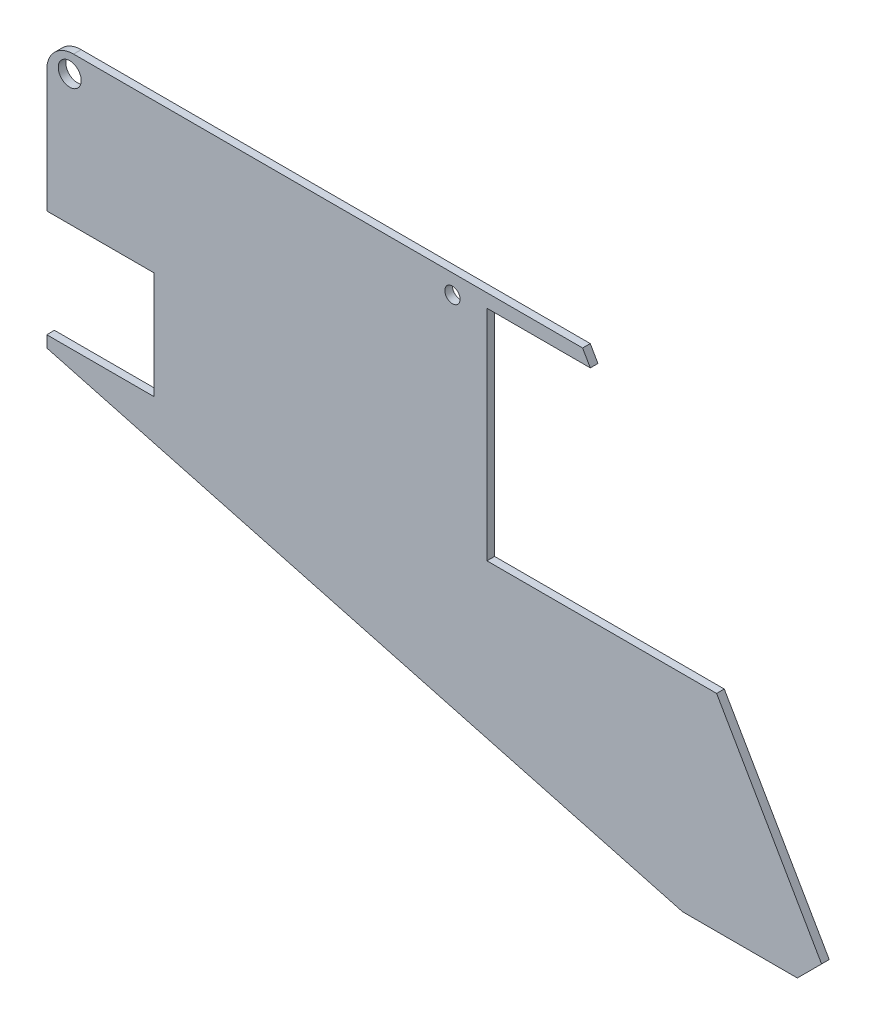
ISO-10303-21;
HEADER;
FILE_DESCRIPTION(('STEP AP214'),'2;1');
FILE_NAME('part.step','',(''),(''),'','','');
FILE_SCHEMA(('AUTOMOTIVE_DESIGN { 1 0 10303 214 1 1 1 1 }'));
ENDSEC;
DATA;
#1=APPLICATION_CONTEXT('core data for automotive mechanical design processes');
#2=APPLICATION_PROTOCOL_DEFINITION('international standard','automotive_design',2000,#1);
#3=PRODUCT_CONTEXT('',#1,'mechanical');
#4=PRODUCT('Part','Part','',(#3));
#5=PRODUCT_RELATED_PRODUCT_CATEGORY('part','',(#4));
#6=PRODUCT_DEFINITION_FORMATION('','',#4);
#7=PRODUCT_DEFINITION_CONTEXT('part definition',#1,'design');
#8=PRODUCT_DEFINITION('design','',#6,#7);
#9=PRODUCT_DEFINITION_SHAPE('','',#8);
#10=(LENGTH_UNIT() NAMED_UNIT(*) SI_UNIT(.MILLI.,.METRE.));
#11=(NAMED_UNIT(*) PLANE_ANGLE_UNIT() SI_UNIT($,.RADIAN.));
#12=(NAMED_UNIT(*) SI_UNIT($,.STERADIAN.) SOLID_ANGLE_UNIT());
#13=UNCERTAINTY_MEASURE_WITH_UNIT(LENGTH_MEASURE(1.E-05),#10,'distance_accuracy_value','');
#14=(GEOMETRIC_REPRESENTATION_CONTEXT(3) GLOBAL_UNCERTAINTY_ASSIGNED_CONTEXT((#13)) GLOBAL_UNIT_ASSIGNED_CONTEXT((#10,
#11,#12)) REPRESENTATION_CONTEXT('',''));
#15=CARTESIAN_POINT('',(0.,0.,0.));
#16=DIRECTION('',(0.,0.,1.));
#17=DIRECTION('',(1.,0.,0.));
#18=AXIS2_PLACEMENT_3D('',#15,#16,#17);
#19=CARTESIAN_POINT('',(-350.,0.,5.));
#20=DIRECTION('',(1.,0.,0.));
#21=DIRECTION('',(0.,0.,-1.));
#22=AXIS2_PLACEMENT_3D('',#19,#20,#21);
#23=PLANE('',#22);
#24=DIRECTION('',(0.,-1.,0.));
#25=VECTOR('',#24,1.);
#26=CARTESIAN_POINT('',(-350.,0.,-5.));
#27=LINE('',#26,#25);
#28=CARTESIAN_POINT('',(-350.,140.,-5.));
#29=VERTEX_POINT('',#28);
#30=CARTESIAN_POINT('',(-350.,-20.,-5.));
#31=VERTEX_POINT('',#30);
#32=EDGE_CURVE('E175',#29,#31,#27,.T.);
#33=ORIENTED_EDGE('',*,*,#32,.T.);
#34=DIRECTION('',(0.,0.,1.));
#35=VECTOR('',#34,1.);
#36=CARTESIAN_POINT('',(-350.,-20.,-5.));
#37=LINE('',#36,#35);
#38=CARTESIAN_POINT('',(-350.,-20.,5.));
#39=VERTEX_POINT('',#38);
#40=EDGE_CURVE('E248',#31,#39,#37,.T.);
#41=ORIENTED_EDGE('',*,*,#40,.T.);
#42=DIRECTION('',(0.,-1.,0.));
#43=VECTOR('',#42,1.);
#44=CARTESIAN_POINT('',(-350.,0.,5.));
#45=LINE('',#44,#43);
#46=CARTESIAN_POINT('',(-350.,140.,5.));
#47=VERTEX_POINT('',#46);
#48=EDGE_CURVE('E249',#47,#39,#45,.T.);
#49=ORIENTED_EDGE('',*,*,#48,.F.);
#50=DIRECTION('',(0.,0.,-1.));
#51=VECTOR('',#50,1.);
#52=CARTESIAN_POINT('',(-350.,140.,5.));
#53=LINE('',#52,#51);
#54=EDGE_CURVE('E203',#47,#29,#53,.T.);
#55=ORIENTED_EDGE('',*,*,#54,.T.);
#56=EDGE_LOOP('',(#33,#41,#49,#55));
#57=FACE_BOUND('',#56,.T.);
#58=ADVANCED_FACE('F43',(#57),#23,.F.);
#59=CARTESIAN_POINT('',(338.27722283114,195.304445662275,5.));
#60=DIRECTION('',(-0.866025403784442,-0.499999999999995,0.));
#61=DIRECTION('',(0.499999999999995,-0.866025403784442,0.));
#62=AXIS2_PLACEMENT_3D('',#59,#60,#61);
#63=PLANE('',#62);
#64=DIRECTION('',(-0.499999999999995,0.866025403784442,0.));
#65=VECTOR('',#64,1.);
#66=CARTESIAN_POINT('',(338.27722283114,195.304445662275,5.));
#67=LINE('',#66,#65);
#68=CARTESIAN_POINT('',(662.259526419155,-365.84936490538,5.));
#69=VERTEX_POINT('',#68);
#70=CARTESIAN_POINT('',(525.111069989298,-128.301270189222,5.));
#71=VERTEX_POINT('',#70);
#72=EDGE_CURVE('E221',#69,#71,#67,.T.);
#73=ORIENTED_EDGE('',*,*,#72,.F.);
#74=DIRECTION('',(0.,0.,-1.));
#75=VECTOR('',#74,1.);
#76=CARTESIAN_POINT('',(662.259526419155,-365.84936490538,5.));
#77=LINE('',#76,#75);
#78=CARTESIAN_POINT('',(662.259526419155,-365.84936490538,-5.));
#79=VERTEX_POINT('',#78);
#80=EDGE_CURVE('E212',#69,#79,#77,.T.);
#81=ORIENTED_EDGE('',*,*,#80,.T.);
#82=DIRECTION('',(-0.499999999999995,0.866025403784442,0.));
#83=VECTOR('',#82,1.);
#84=CARTESIAN_POINT('',(338.27722283114,195.304445662275,-5.));
#85=LINE('',#84,#83);
#86=CARTESIAN_POINT('',(525.111069989298,-128.301270189222,-5.));
#87=VERTEX_POINT('',#86);
#88=EDGE_CURVE('E190',#79,#87,#85,.T.);
#89=ORIENTED_EDGE('',*,*,#88,.T.);
#90=DIRECTION('',(0.,0.,1.));
#91=VECTOR('',#90,1.);
#92=CARTESIAN_POINT('',(525.111069989298,-128.301270189222,-5.));
#93=LINE('',#92,#91);
#94=EDGE_CURVE('E295',#87,#71,#93,.T.);
#95=ORIENTED_EDGE('',*,*,#94,.T.);
#96=EDGE_LOOP('',(#73,#81,#89,#95));
#97=FACE_BOUND('',#96,.T.);
#98=ADVANCED_FACE('F218',(#97),#63,.F.);
#99=CARTESIAN_POINT('',(-350.,-160.,5.));
#100=VERTEX_POINT('',#99);
#101=CARTESIAN_POINT('',(-350.,-175.,5.));
#102=VERTEX_POINT('',#101);
#103=EDGE_CURVE('E169',#100,#102,#45,.T.);
#104=ORIENTED_EDGE('',*,*,#103,.F.);
#105=DIRECTION('',(0.,0.,1.));
#106=VECTOR('',#105,1.);
#107=CARTESIAN_POINT('',(-350.,-160.,-5.));
#108=LINE('',#107,#106);
#109=CARTESIAN_POINT('',(-350.,-160.,-5.));
#110=VERTEX_POINT('',#109);
#111=EDGE_CURVE('E155',#110,#100,#108,.T.);
#112=ORIENTED_EDGE('',*,*,#111,.F.);
#113=CARTESIAN_POINT('',(-350.,-175.,-5.));
#114=VERTEX_POINT('',#113);
#115=EDGE_CURVE('E167',#110,#114,#27,.T.);
#116=ORIENTED_EDGE('',*,*,#115,.T.);
#117=DIRECTION('',(0.,0.,-1.));
#118=VECTOR('',#117,1.);
#119=CARTESIAN_POINT('',(-350.,-175.,5.));
#120=LINE('',#119,#118);
#121=EDGE_CURVE('E201',#102,#114,#120,.T.);
#122=ORIENTED_EDGE('',*,*,#121,.F.);
#123=EDGE_LOOP('',(#104,#112,#116,#122));
#124=FACE_BOUND('',#123,.T.);
#125=ADVANCED_FACE('F165',(#124),#23,.F.);
#126=CARTESIAN_POINT('',(-67.195554337721,-250.777222831137,5.));
#127=DIRECTION('',(0.258819045102514,0.96592582628907,0.));
#128=DIRECTION('',(-0.96592582628907,0.258819045102514,0.));
#129=AXIS2_PLACEMENT_3D('',#126,#127,#128);
#130=PLANE('',#129);
#131=DIRECTION('',(0.96592582628907,-0.258819045102514,0.));
#132=VECTOR('',#131,1.);
#133=CARTESIAN_POINT('',(-67.195554337721,-250.777222831137,-5.));
#134=LINE('',#133,#132);
#135=CARTESIAN_POINT('',(480.560796608377,-397.548094716159,-5.));
#136=VERTEX_POINT('',#135);
#137=EDGE_CURVE('E173',#114,#136,#134,.T.);
#138=ORIENTED_EDGE('',*,*,#137,.T.);
#139=DIRECTION('',(0.,0.,-1.));
#140=VECTOR('',#139,1.);
#141=CARTESIAN_POINT('',(480.560796608377,-397.548094716159,5.));
#142=LINE('',#141,#140);
#143=CARTESIAN_POINT('',(480.560796608377,-397.548094716159,5.));
#144=VERTEX_POINT('',#143);
#145=EDGE_CURVE('E198',#144,#136,#142,.T.);
#146=ORIENTED_EDGE('',*,*,#145,.F.);
#147=DIRECTION('',(0.96592582628907,-0.258819045102514,0.));
#148=VECTOR('',#147,1.);
#149=CARTESIAN_POINT('',(-67.195554337721,-250.777222831137,5.));
#150=LINE('',#149,#148);
#151=EDGE_CURVE('E252',#102,#144,#150,.T.);
#152=ORIENTED_EDGE('',*,*,#151,.F.);
#153=ORIENTED_EDGE('',*,*,#121,.T.);
#154=EDGE_LOOP('',(#138,#146,#152,#153));
#155=FACE_BOUND('',#154,.T.);
#156=ADVANCED_FACE('F335',(#155),#130,.F.);
#157=CARTESIAN_POINT('',(0.,-397.548094716159,5.));
#158=DIRECTION('',(0.,1.,0.));
#159=DIRECTION('',(0.,0.,1.));
#160=AXIS2_PLACEMENT_3D('',#157,#158,#159);
#161=PLANE('',#160);
#162=DIRECTION('',(1.,0.,0.));
#163=VECTOR('',#162,1.);
#164=CARTESIAN_POINT('',(0.,-397.548094716159,-5.));
#165=LINE('',#164,#163);
#166=CARTESIAN_POINT('',(630.560796608377,-397.548094716159,-5.));
#167=VERTEX_POINT('',#166);
#168=EDGE_CURVE('E187',#136,#167,#165,.T.);
#169=ORIENTED_EDGE('',*,*,#168,.T.);
#170=DIRECTION('',(0.,0.,1.));
#171=VECTOR('',#170,1.);
#172=CARTESIAN_POINT('',(630.560796608377,-397.548094716159,5.));
#173=LINE('',#172,#171);
#174=CARTESIAN_POINT('',(630.560796608377,-397.548094716159,5.));
#175=VERTEX_POINT('',#174);
#176=EDGE_CURVE('E52',#167,#175,#173,.T.);
#177=ORIENTED_EDGE('',*,*,#176,.T.);
#178=DIRECTION('',(1.,0.,0.));
#179=VECTOR('',#178,1.);
#180=CARTESIAN_POINT('',(0.,-397.548094716159,5.));
#181=LINE('',#180,#179);
#182=EDGE_CURVE('E254',#144,#175,#181,.T.);
#183=ORIENTED_EDGE('',*,*,#182,.F.);
#184=ORIENTED_EDGE('',*,*,#145,.T.);
#185=EDGE_LOOP('',(#169,#177,#183,#184));
#186=FACE_BOUND('',#185,.T.);
#187=ADVANCED_FACE('F339',(#186),#161,.F.);
#188=CARTESIAN_POINT('',(360.111069989298,157.487113059643,5.));
#189=VERTEX_POINT('',#188);
#190=CARTESIAN_POINT('',(350.,175.,5.));
#191=VERTEX_POINT('',#190);
#192=EDGE_CURVE('E255',#189,#191,#67,.T.);
#193=ORIENTED_EDGE('',*,*,#192,.F.);
#194=DIRECTION('',(0.,0.,1.));
#195=VECTOR('',#194,1.);
#196=CARTESIAN_POINT('',(360.111069989298,157.487113059643,-5.));
#197=LINE('',#196,#195);
#198=CARTESIAN_POINT('',(360.111069989298,157.487113059643,-5.));
#199=VERTEX_POINT('',#198);
#200=EDGE_CURVE('E297',#199,#189,#197,.T.);
#201=ORIENTED_EDGE('',*,*,#200,.F.);
#202=CARTESIAN_POINT('',(350.,175.,-5.));
#203=VERTEX_POINT('',#202);
#204=EDGE_CURVE('E189',#199,#203,#85,.T.);
#205=ORIENTED_EDGE('',*,*,#204,.T.);
#206=DIRECTION('',(0.,0.,-1.));
#207=VECTOR('',#206,1.);
#208=CARTESIAN_POINT('',(350.,175.,5.));
#209=LINE('',#208,#207);
#210=EDGE_CURVE('E195',#191,#203,#209,.T.);
#211=ORIENTED_EDGE('',*,*,#210,.F.);
#212=EDGE_LOOP('',(#193,#201,#205,#211));
#213=FACE_BOUND('',#212,.T.);
#214=ADVANCED_FACE('F271',(#213),#63,.F.);
#215=CARTESIAN_POINT('',(0.,175.,5.));
#216=DIRECTION('',(0.,-1.,0.));
#217=DIRECTION('',(1.,0.,0.));
#218=AXIS2_PLACEMENT_3D('',#215,#216,#217);
#219=PLANE('',#218);
#220=DIRECTION('',(-1.,0.,0.));
#221=VECTOR('',#220,1.);
#222=CARTESIAN_POINT('',(0.,175.,-5.));
#223=LINE('',#222,#221);
#224=CARTESIAN_POINT('',(-315.,175.,-5.));
#225=VERTEX_POINT('',#224);
#226=EDGE_CURVE('E192',#203,#225,#223,.T.);
#227=ORIENTED_EDGE('',*,*,#226,.T.);
#228=DIRECTION('',(0.,0.,-1.));
#229=VECTOR('',#228,1.);
#230=CARTESIAN_POINT('',(-315.,175.,5.));
#231=LINE('',#230,#229);
#232=CARTESIAN_POINT('',(-315.,175.,5.));
#233=VERTEX_POINT('',#232);
#234=EDGE_CURVE('E208',#225,#233,#231,.F.);
#235=ORIENTED_EDGE('',*,*,#234,.T.);
#236=DIRECTION('',(-1.,0.,0.));
#237=VECTOR('',#236,1.);
#238=CARTESIAN_POINT('',(0.,175.,5.));
#239=LINE('',#238,#237);
#240=EDGE_CURVE('E184',#191,#233,#239,.T.);
#241=ORIENTED_EDGE('',*,*,#240,.F.);
#242=ORIENTED_EDGE('',*,*,#210,.T.);
#243=EDGE_LOOP('',(#227,#235,#241,#242));
#244=FACE_BOUND('',#243,.T.);
#245=ADVANCED_FACE('F275',(#244),#219,.F.);
#246=CARTESIAN_POINT('',(0.,0.,5.));
#247=DIRECTION('',(0.,0.,1.));
#248=DIRECTION('',(1.,0.,0.));
#249=AXIS2_PLACEMENT_3D('',#246,#247,#248);
#250=PLANE('',#249);
#251=ORIENTED_EDGE('',*,*,#182,.T.);
#252=DIRECTION('',(-0.707106781186549,-0.707106781186546,0.));
#253=VECTOR('',#252,1.);
#254=CARTESIAN_POINT('',(514.054445662267,-514.054445662268,5.));
#255=LINE('',#254,#253);
#256=EDGE_CURVE('E11',#175,#69,#255,.F.);
#257=ORIENTED_EDGE('',*,*,#256,.T.);
#258=ORIENTED_EDGE('',*,*,#72,.T.);
#259=DIRECTION('',(1.,0.,0.));
#260=VECTOR('',#259,1.);
#261=CARTESIAN_POINT('',(225.111069989298,-128.301270189222,5.));
#262=LINE('',#261,#260);
#263=CARTESIAN_POINT('',(225.111069989298,-128.301270189222,5.));
#264=VERTEX_POINT('',#263);
#265=EDGE_CURVE('E304',#264,#71,#262,.T.);
#266=ORIENTED_EDGE('',*,*,#265,.F.);
#267=DIRECTION('',(0.,-1.,0.));
#268=VECTOR('',#267,1.);
#269=CARTESIAN_POINT('',(225.111069989298,157.487113059643,5.));
#270=LINE('',#269,#268);
#271=CARTESIAN_POINT('',(225.111069989298,157.487113059643,5.));
#272=VERTEX_POINT('',#271);
#273=EDGE_CURVE('E231',#272,#264,#270,.T.);
#274=ORIENTED_EDGE('',*,*,#273,.F.);
#275=DIRECTION('',(-1.,0.,0.));
#276=VECTOR('',#275,1.);
#277=CARTESIAN_POINT('',(225.111069989298,157.487113059643,5.));
#278=LINE('',#277,#276);
#279=EDGE_CURVE('E235',#189,#272,#278,.T.);
#280=ORIENTED_EDGE('',*,*,#279,.F.);
#281=ORIENTED_EDGE('',*,*,#192,.T.);
#282=ORIENTED_EDGE('',*,*,#240,.T.);
#283=CARTESIAN_POINT('',(-315.,140.,5.));
#284=DIRECTION('',(0.,0.,1.));
#285=DIRECTION('',(1.,0.,0.));
#286=AXIS2_PLACEMENT_3D('',#283,#284,#285);
#287=CIRCLE('',#286,35.);
#288=EDGE_CURVE('E210',#233,#47,#287,.T.);
#289=ORIENTED_EDGE('',*,*,#288,.T.);
#290=ORIENTED_EDGE('',*,*,#48,.T.);
#291=DIRECTION('',(-1.,0.,0.));
#292=VECTOR('',#291,1.);
#293=CARTESIAN_POINT('',(-350.,-20.,5.));
#294=LINE('',#293,#292);
#295=CARTESIAN_POINT('',(-210.,-20.,5.));
#296=VERTEX_POINT('',#295);
#297=EDGE_CURVE('E161',#296,#39,#294,.T.);
#298=ORIENTED_EDGE('',*,*,#297,.F.);
#299=DIRECTION('',(0.,1.,0.));
#300=VECTOR('',#299,1.);
#301=CARTESIAN_POINT('',(-210.,-20.,5.));
#302=LINE('',#301,#300);
#303=CARTESIAN_POINT('',(-210.,-160.,5.));
#304=VERTEX_POINT('',#303);
#305=EDGE_CURVE('E306',#304,#296,#302,.T.);
#306=ORIENTED_EDGE('',*,*,#305,.F.);
#307=DIRECTION('',(1.,0.,0.));
#308=VECTOR('',#307,1.);
#309=CARTESIAN_POINT('',(-350.,-160.,5.));
#310=LINE('',#309,#308);
#311=EDGE_CURVE('E305',#100,#304,#310,.T.);
#312=ORIENTED_EDGE('',*,*,#311,.F.);
#313=ORIENTED_EDGE('',*,*,#103,.T.);
#314=ORIENTED_EDGE('',*,*,#151,.T.);
#315=EDGE_LOOP('',(#251,#257,#258,#266,#274,#280,#281,#282,#289,#290,#298,#306,#312,#313,#314));
#316=FACE_BOUND('',#315,.T.);
#317=CARTESIAN_POINT('',(-320.,150.,5.));
#318=DIRECTION('',(0.,0.,1.));
#319=DIRECTION('',(1.,0.,0.));
#320=AXIS2_PLACEMENT_3D('',#317,#318,#319);
#321=CIRCLE('',#320,15.);
#322=CARTESIAN_POINT('',(-305.,150.,5.));
#323=VERTEX_POINT('',#322);
#324=EDGE_CURVE('E180',#323,#323,#321,.T.);
#325=ORIENTED_EDGE('',*,*,#324,.F.);
#326=EDGE_LOOP('',(#325));
#327=FACE_BOUND('',#326,.T.);
#328=CARTESIAN_POINT('',(180.,150.,5.));
#329=DIRECTION('',(0.,0.,1.));
#330=DIRECTION('',(1.,0.,0.));
#331=AXIS2_PLACEMENT_3D('',#328,#329,#330);
#332=CIRCLE('',#331,10.);
#333=CARTESIAN_POINT('',(190.,150.,5.));
#334=VERTEX_POINT('',#333);
#335=EDGE_CURVE('E242',#334,#334,#332,.T.);
#336=ORIENTED_EDGE('',*,*,#335,.F.);
#337=EDGE_LOOP('',(#336));
#338=FACE_BOUND('',#337,.T.);
#339=ADVANCED_FACE('F263',(#316,#327,#338),#250,.T.);
#340=CARTESIAN_POINT('',(0.,0.,-5.));
#341=DIRECTION('',(0.,0.,1.));
#342=DIRECTION('',(1.,0.,0.));
#343=AXIS2_PLACEMENT_3D('',#340,#341,#342);
#344=PLANE('',#343);
#345=CARTESIAN_POINT('',(-320.,150.,-5.));
#346=DIRECTION('',(0.,0.,1.));
#347=DIRECTION('',(1.,0.,0.));
#348=AXIS2_PLACEMENT_3D('',#345,#346,#347);
#349=CIRCLE('',#348,15.);
#350=CARTESIAN_POINT('',(-305.,150.,-5.));
#351=VERTEX_POINT('',#350);
#352=EDGE_CURVE('E176',#351,#351,#349,.T.);
#353=ORIENTED_EDGE('',*,*,#352,.T.);
#354=EDGE_LOOP('',(#353));
#355=FACE_BOUND('',#354,.T.);
#356=CARTESIAN_POINT('',(180.,150.,-5.));
#357=DIRECTION('',(0.,0.,1.));
#358=DIRECTION('',(1.,0.,0.));
#359=AXIS2_PLACEMENT_3D('',#356,#357,#358);
#360=CIRCLE('',#359,10.);
#361=CARTESIAN_POINT('',(190.,150.,-5.));
#362=VERTEX_POINT('',#361);
#363=EDGE_CURVE('E245',#362,#362,#360,.T.);
#364=ORIENTED_EDGE('',*,*,#363,.T.);
#365=EDGE_LOOP('',(#364));
#366=FACE_BOUND('',#365,.T.);
#367=ORIENTED_EDGE('',*,*,#88,.F.);
#368=DIRECTION('',(0.707106781186549,0.707106781186546,0.));
#369=VECTOR('',#368,1.);
#370=CARTESIAN_POINT('',(662.259526419155,-365.84936490538,-5.));
#371=LINE('',#370,#369);
#372=EDGE_CURVE('E66',#79,#167,#371,.F.);
#373=ORIENTED_EDGE('',*,*,#372,.T.);
#374=ORIENTED_EDGE('',*,*,#168,.F.);
#375=ORIENTED_EDGE('',*,*,#137,.F.);
#376=ORIENTED_EDGE('',*,*,#115,.F.);
#377=DIRECTION('',(1.,0.,0.));
#378=VECTOR('',#377,1.);
#379=CARTESIAN_POINT('',(-350.,-160.,-5.));
#380=LINE('',#379,#378);
#381=CARTESIAN_POINT('',(-210.,-160.,-5.));
#382=VERTEX_POINT('',#381);
#383=EDGE_CURVE('E151',#110,#382,#380,.T.);
#384=ORIENTED_EDGE('',*,*,#383,.T.);
#385=DIRECTION('',(0.,1.,0.));
#386=VECTOR('',#385,1.);
#387=CARTESIAN_POINT('',(-210.,-20.,-5.));
#388=LINE('',#387,#386);
#389=CARTESIAN_POINT('',(-210.,-20.,-5.));
#390=VERTEX_POINT('',#389);
#391=EDGE_CURVE('E160',#382,#390,#388,.T.);
#392=ORIENTED_EDGE('',*,*,#391,.T.);
#393=DIRECTION('',(-1.,0.,0.));
#394=VECTOR('',#393,1.);
#395=CARTESIAN_POINT('',(-350.,-20.,-5.));
#396=LINE('',#395,#394);
#397=EDGE_CURVE('E170',#390,#31,#396,.T.);
#398=ORIENTED_EDGE('',*,*,#397,.T.);
#399=ORIENTED_EDGE('',*,*,#32,.F.);
#400=CARTESIAN_POINT('',(-315.,140.,-5.));
#401=DIRECTION('',(0.,0.,1.));
#402=DIRECTION('',(1.,0.,0.));
#403=AXIS2_PLACEMENT_3D('',#400,#401,#402);
#404=CIRCLE('',#403,35.);
#405=EDGE_CURVE('E206',#29,#225,#404,.F.);
#406=ORIENTED_EDGE('',*,*,#405,.T.);
#407=ORIENTED_EDGE('',*,*,#226,.F.);
#408=ORIENTED_EDGE('',*,*,#204,.F.);
#409=DIRECTION('',(-1.,0.,0.));
#410=VECTOR('',#409,1.);
#411=CARTESIAN_POINT('',(225.111069989298,157.487113059643,-5.));
#412=LINE('',#411,#410);
#413=CARTESIAN_POINT('',(225.111069989298,157.487113059643,-5.));
#414=VERTEX_POINT('',#413);
#415=EDGE_CURVE('E232',#199,#414,#412,.T.);
#416=ORIENTED_EDGE('',*,*,#415,.T.);
#417=DIRECTION('',(0.,-1.,0.));
#418=VECTOR('',#417,1.);
#419=CARTESIAN_POINT('',(225.111069989298,157.487113059643,-5.));
#420=LINE('',#419,#418);
#421=CARTESIAN_POINT('',(225.111069989298,-128.301270189222,-5.));
#422=VERTEX_POINT('',#421);
#423=EDGE_CURVE('E229',#414,#422,#420,.T.);
#424=ORIENTED_EDGE('',*,*,#423,.T.);
#425=DIRECTION('',(1.,0.,0.));
#426=VECTOR('',#425,1.);
#427=CARTESIAN_POINT('',(225.111069989298,-128.301270189222,-5.));
#428=LINE('',#427,#426);
#429=EDGE_CURVE('E227',#422,#87,#428,.T.);
#430=ORIENTED_EDGE('',*,*,#429,.T.);
#431=EDGE_LOOP('',(#367,#373,#374,#375,#376,#384,#392,#398,#399,#406,#407,#408,#416,#424,#430));
#432=FACE_BOUND('',#431,.T.);
#433=ADVANCED_FACE('F172',(#355,#366,#432),#344,.F.);
#434=CARTESIAN_POINT('',(180.,150.,-5.));
#435=DIRECTION('',(0.,0.,1.));
#436=DIRECTION('',(1.,0.,0.));
#437=AXIS2_PLACEMENT_3D('',#434,#435,#436);
#438=CYLINDRICAL_SURFACE('',#437,10.);
#439=ORIENTED_EDGE('',*,*,#363,.F.);
#440=EDGE_LOOP('',(#439));
#441=FACE_BOUND('',#440,.T.);
#442=ORIENTED_EDGE('',*,*,#335,.T.);
#443=EDGE_LOOP('',(#442));
#444=FACE_BOUND('',#443,.T.);
#445=ADVANCED_FACE('F352',(#441,#444),#438,.F.);
#446=CARTESIAN_POINT('',(-320.,150.,-5.));
#447=DIRECTION('',(0.,0.,1.));
#448=DIRECTION('',(1.,0.,0.));
#449=AXIS2_PLACEMENT_3D('',#446,#447,#448);
#450=CYLINDRICAL_SURFACE('',#449,15.);
#451=ORIENTED_EDGE('',*,*,#352,.F.);
#452=EDGE_LOOP('',(#451));
#453=FACE_BOUND('',#452,.T.);
#454=ORIENTED_EDGE('',*,*,#324,.T.);
#455=EDGE_LOOP('',(#454));
#456=FACE_BOUND('',#455,.T.);
#457=ADVANCED_FACE('F358',(#453,#456),#450,.F.);
#458=CARTESIAN_POINT('',(-315.,140.,5.));
#459=DIRECTION('',(0.,0.,-1.));
#460=DIRECTION('',(-1.,0.,0.));
#461=AXIS2_PLACEMENT_3D('',#458,#459,#460);
#462=CYLINDRICAL_SURFACE('',#461,35.);
#463=ORIENTED_EDGE('',*,*,#288,.F.);
#464=ORIENTED_EDGE('',*,*,#234,.F.);
#465=ORIENTED_EDGE('',*,*,#405,.F.);
#466=ORIENTED_EDGE('',*,*,#54,.F.);
#467=EDGE_LOOP('',(#463,#464,#465,#466));
#468=FACE_BOUND('',#467,.T.);
#469=ADVANCED_FACE('F278',(#468),#462,.T.);
#470=CARTESIAN_POINT('',(225.111069989298,-128.301270189222,-5.));
#471=DIRECTION('',(0.,-1.,0.));
#472=DIRECTION('',(0.,0.,-1.));
#473=AXIS2_PLACEMENT_3D('',#470,#471,#472);
#474=PLANE('',#473);
#475=ORIENTED_EDGE('',*,*,#265,.T.);
#476=ORIENTED_EDGE('',*,*,#94,.F.);
#477=ORIENTED_EDGE('',*,*,#429,.F.);
#478=DIRECTION('',(0.,0.,1.));
#479=VECTOR('',#478,1.);
#480=CARTESIAN_POINT('',(225.111069989298,-128.301270189222,-5.));
#481=LINE('',#480,#479);
#482=EDGE_CURVE('E301',#422,#264,#481,.T.);
#483=ORIENTED_EDGE('',*,*,#482,.T.);
#484=EDGE_LOOP('',(#475,#476,#477,#483));
#485=FACE_BOUND('',#484,.T.);
#486=ADVANCED_FACE('F364',(#485),#474,.F.);
#487=CARTESIAN_POINT('',(225.111069989298,157.487113059643,-5.));
#488=DIRECTION('',(-1.,0.,0.));
#489=DIRECTION('',(0.,-1.,0.));
#490=AXIS2_PLACEMENT_3D('',#487,#488,#489);
#491=PLANE('',#490);
#492=ORIENTED_EDGE('',*,*,#273,.T.);
#493=ORIENTED_EDGE('',*,*,#482,.F.);
#494=ORIENTED_EDGE('',*,*,#423,.F.);
#495=DIRECTION('',(0.,0.,1.));
#496=VECTOR('',#495,1.);
#497=CARTESIAN_POINT('',(225.111069989298,157.487113059643,-5.));
#498=LINE('',#497,#496);
#499=EDGE_CURVE('E299',#414,#272,#498,.T.);
#500=ORIENTED_EDGE('',*,*,#499,.T.);
#501=EDGE_LOOP('',(#492,#493,#494,#500));
#502=FACE_BOUND('',#501,.T.);
#503=ADVANCED_FACE('F323',(#502),#491,.F.);
#504=CARTESIAN_POINT('',(225.111069989298,157.487113059643,-5.));
#505=DIRECTION('',(0.,1.,0.));
#506=DIRECTION('',(-1.,0.,0.));
#507=AXIS2_PLACEMENT_3D('',#504,#505,#506);
#508=PLANE('',#507);
#509=ORIENTED_EDGE('',*,*,#279,.T.);
#510=ORIENTED_EDGE('',*,*,#499,.F.);
#511=ORIENTED_EDGE('',*,*,#415,.F.);
#512=ORIENTED_EDGE('',*,*,#200,.T.);
#513=EDGE_LOOP('',(#509,#510,#511,#512));
#514=FACE_BOUND('',#513,.T.);
#515=ADVANCED_FACE('F316',(#514),#508,.F.);
#516=CARTESIAN_POINT('',(-350.,-20.,-5.));
#517=DIRECTION('',(0.,1.,0.));
#518=DIRECTION('',(-1.,0.,0.));
#519=AXIS2_PLACEMENT_3D('',#516,#517,#518);
#520=PLANE('',#519);
#521=ORIENTED_EDGE('',*,*,#297,.T.);
#522=ORIENTED_EDGE('',*,*,#40,.F.);
#523=ORIENTED_EDGE('',*,*,#397,.F.);
#524=DIRECTION('',(0.,0.,1.));
#525=VECTOR('',#524,1.);
#526=CARTESIAN_POINT('',(-210.,-20.,-5.));
#527=LINE('',#526,#525);
#528=EDGE_CURVE('E288',#390,#296,#527,.T.);
#529=ORIENTED_EDGE('',*,*,#528,.T.);
#530=EDGE_LOOP('',(#521,#522,#523,#529));
#531=FACE_BOUND('',#530,.T.);
#532=ADVANCED_FACE('F314',(#531),#520,.F.);
#533=CARTESIAN_POINT('',(-210.,-20.,-5.));
#534=DIRECTION('',(1.,0.,0.));
#535=DIRECTION('',(0.,1.,0.));
#536=AXIS2_PLACEMENT_3D('',#533,#534,#535);
#537=PLANE('',#536);
#538=ORIENTED_EDGE('',*,*,#305,.T.);
#539=ORIENTED_EDGE('',*,*,#528,.F.);
#540=ORIENTED_EDGE('',*,*,#391,.F.);
#541=DIRECTION('',(0.,0.,1.));
#542=VECTOR('',#541,1.);
#543=CARTESIAN_POINT('',(-210.,-160.,-5.));
#544=LINE('',#543,#542);
#545=EDGE_CURVE('E157',#382,#304,#544,.T.);
#546=ORIENTED_EDGE('',*,*,#545,.T.);
#547=EDGE_LOOP('',(#538,#539,#540,#546));
#548=FACE_BOUND('',#547,.T.);
#549=ADVANCED_FACE('F313',(#548),#537,.F.);
#550=CARTESIAN_POINT('',(-350.,-160.,-5.));
#551=DIRECTION('',(0.,-1.,0.));
#552=DIRECTION('',(0.,0.,-1.));
#553=AXIS2_PLACEMENT_3D('',#550,#551,#552);
#554=PLANE('',#553);
#555=ORIENTED_EDGE('',*,*,#311,.T.);
#556=ORIENTED_EDGE('',*,*,#545,.F.);
#557=ORIENTED_EDGE('',*,*,#383,.F.);
#558=ORIENTED_EDGE('',*,*,#111,.T.);
#559=EDGE_LOOP('',(#555,#556,#557,#558));
#560=FACE_BOUND('',#559,.T.);
#561=ADVANCED_FACE('F154',(#560),#554,.F.);
#562=CARTESIAN_POINT('',(662.259526419155,-365.84936490538,5.));
#563=DIRECTION('',(-0.707106781186546,0.707106781186549,0.));
#564=DIRECTION('',(0.,0.,-1.));
#565=AXIS2_PLACEMENT_3D('',#562,#563,#564);
#566=PLANE('',#565);
#567=ORIENTED_EDGE('',*,*,#256,.F.);
#568=ORIENTED_EDGE('',*,*,#176,.F.);
#569=ORIENTED_EDGE('',*,*,#372,.F.);
#570=ORIENTED_EDGE('',*,*,#80,.F.);
#571=EDGE_LOOP('',(#567,#568,#569,#570));
#572=FACE_BOUND('',#571,.T.);
#573=ADVANCED_FACE('F46',(#572),#566,.F.);
#574=CLOSED_SHELL('',(#58,#98,#125,#156,#187,#214,#245,#339,#433,#445,#457,#469,#486,#503,#515,
#532,#549,#561,#573));
#575=MANIFOLD_SOLID_BREP('B2',#574);
#576=ADVANCED_BREP_SHAPE_REPRESENTATION('',(#18,#575),#14);
#577=SHAPE_DEFINITION_REPRESENTATION(#9,#576);
ENDSEC;
END-ISO-10303-21;
